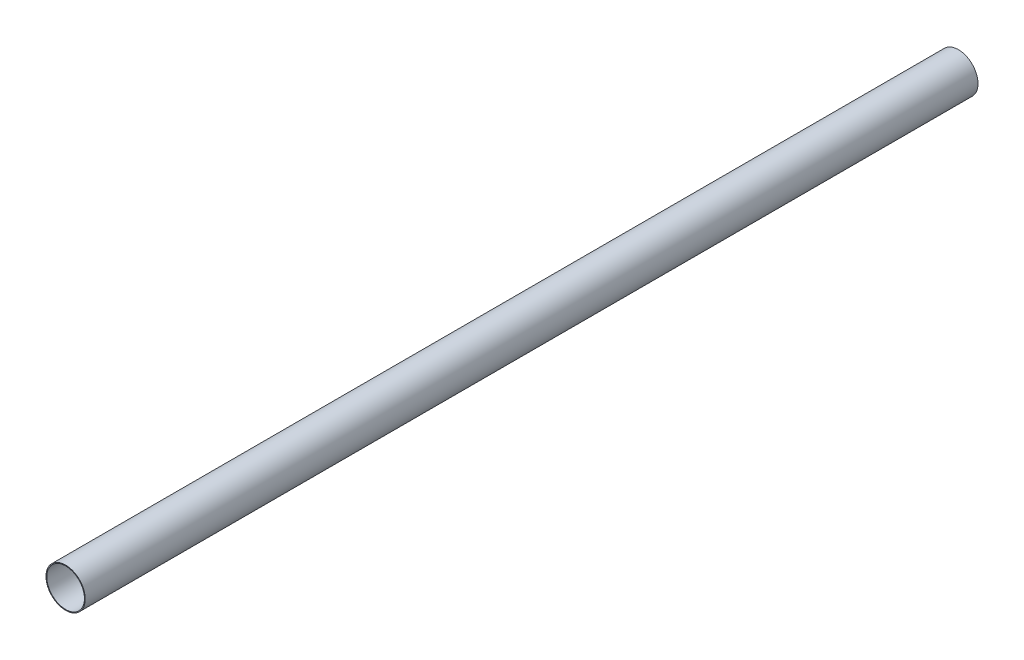
ISO-10303-21;
HEADER;
FILE_DESCRIPTION(('STEP AP214'),'2;1');
FILE_NAME('part.step','',(''),(''),'','','');
FILE_SCHEMA(('AUTOMOTIVE_DESIGN { 1 0 10303 214 1 1 1 1 }'));
ENDSEC;
DATA;
#1=APPLICATION_CONTEXT('core data for automotive mechanical design processes');
#2=APPLICATION_PROTOCOL_DEFINITION('international standard','automotive_design',2000,#1);
#3=PRODUCT_CONTEXT('',#1,'mechanical');
#4=PRODUCT('Part','Part','',(#3));
#5=PRODUCT_RELATED_PRODUCT_CATEGORY('part','',(#4));
#6=PRODUCT_DEFINITION_FORMATION('','',#4);
#7=PRODUCT_DEFINITION_CONTEXT('part definition',#1,'design');
#8=PRODUCT_DEFINITION('design','',#6,#7);
#9=PRODUCT_DEFINITION_SHAPE('','',#8);
#10=(LENGTH_UNIT() NAMED_UNIT(*) SI_UNIT(.MILLI.,.METRE.));
#11=(NAMED_UNIT(*) PLANE_ANGLE_UNIT() SI_UNIT($,.RADIAN.));
#12=(NAMED_UNIT(*) SI_UNIT($,.STERADIAN.) SOLID_ANGLE_UNIT());
#13=UNCERTAINTY_MEASURE_WITH_UNIT(LENGTH_MEASURE(1.E-05),#10,'distance_accuracy_value','');
#14=(GEOMETRIC_REPRESENTATION_CONTEXT(3) GLOBAL_UNCERTAINTY_ASSIGNED_CONTEXT((#13)) GLOBAL_UNIT_ASSIGNED_CONTEXT((#10,
#11,#12)) REPRESENTATION_CONTEXT('',''));
#15=CARTESIAN_POINT('',(0.,0.,0.));
#16=DIRECTION('',(0.,0.,1.));
#17=DIRECTION('',(1.,0.,0.));
#18=AXIS2_PLACEMENT_3D('',#15,#16,#17);
#19=CARTESIAN_POINT('',(0.,0.,2500.));
#20=DIRECTION('',(0.,0.,1.));
#21=DIRECTION('',(1.,0.,0.));
#22=AXIS2_PLACEMENT_3D('',#19,#20,#21);
#23=PLANE('',#22);
#24=CARTESIAN_POINT('',(0.,0.,2500.));
#25=DIRECTION('',(0.,0.,1.));
#26=DIRECTION('',(1.,0.,0.));
#27=AXIS2_PLACEMENT_3D('',#24,#25,#26);
#28=CIRCLE('',#27,55.);
#29=CARTESIAN_POINT('',(55.,0.,2500.));
#30=VERTEX_POINT('',#29);
#31=EDGE_CURVE('E10',#30,#30,#28,.T.);
#32=ORIENTED_EDGE('',*,*,#31,.T.);
#33=EDGE_LOOP('',(#32));
#34=FACE_BOUND('',#33,.T.);
#35=CARTESIAN_POINT('',(0.,0.,2500.));
#36=DIRECTION('',(0.,0.,1.));
#37=DIRECTION('',(1.,0.,0.));
#38=AXIS2_PLACEMENT_3D('',#35,#36,#37);
#39=CIRCLE('',#38,52.8);
#40=CARTESIAN_POINT('',(52.8,0.,2500.));
#41=VERTEX_POINT('',#40);
#42=EDGE_CURVE('E42',#41,#41,#39,.T.);
#43=ORIENTED_EDGE('',*,*,#42,.F.);
#44=EDGE_LOOP('',(#43));
#45=FACE_BOUND('',#44,.T.);
#46=ADVANCED_FACE('F31',(#34,#45),#23,.T.);
#47=CARTESIAN_POINT('',(0.,0.,0.));
#48=DIRECTION('',(0.,0.,1.));
#49=DIRECTION('',(1.,0.,0.));
#50=AXIS2_PLACEMENT_3D('',#47,#48,#49);
#51=PLANE('',#50);
#52=CARTESIAN_POINT('',(0.,0.,0.));
#53=DIRECTION('',(0.,0.,1.));
#54=DIRECTION('',(1.,0.,0.));
#55=AXIS2_PLACEMENT_3D('',#52,#53,#54);
#56=CIRCLE('',#55,55.);
#57=CARTESIAN_POINT('',(55.,0.,0.));
#58=VERTEX_POINT('',#57);
#59=EDGE_CURVE('E35',#58,#58,#56,.T.);
#60=ORIENTED_EDGE('',*,*,#59,.F.);
#61=EDGE_LOOP('',(#60));
#62=FACE_BOUND('',#61,.T.);
#63=CARTESIAN_POINT('',(0.,0.,0.));
#64=DIRECTION('',(0.,0.,1.));
#65=DIRECTION('',(1.,0.,0.));
#66=AXIS2_PLACEMENT_3D('',#63,#64,#65);
#67=CIRCLE('',#66,52.8);
#68=CARTESIAN_POINT('',(52.8,0.,0.));
#69=VERTEX_POINT('',#68);
#70=EDGE_CURVE('E44',#69,#69,#67,.T.);
#71=ORIENTED_EDGE('',*,*,#70,.T.);
#72=EDGE_LOOP('',(#71));
#73=FACE_BOUND('',#72,.T.);
#74=ADVANCED_FACE('F54',(#62,#73),#51,.F.);
#75=CARTESIAN_POINT('',(0.,0.,2500.));
#76=DIRECTION('',(0.,0.,-1.));
#77=DIRECTION('',(-1.,0.,0.));
#78=AXIS2_PLACEMENT_3D('',#75,#76,#77);
#79=CYLINDRICAL_SURFACE('',#78,55.);
#80=ORIENTED_EDGE('',*,*,#31,.F.);
#81=EDGE_LOOP('',(#80));
#82=FACE_BOUND('',#81,.T.);
#83=ORIENTED_EDGE('',*,*,#59,.T.);
#84=EDGE_LOOP('',(#83));
#85=FACE_BOUND('',#84,.T.);
#86=ADVANCED_FACE('F33',(#82,#85),#79,.T.);
#87=CARTESIAN_POINT('',(0.,0.,2500.));
#88=DIRECTION('',(0.,0.,-1.));
#89=DIRECTION('',(-1.,0.,0.));
#90=AXIS2_PLACEMENT_3D('',#87,#88,#89);
#91=CYLINDRICAL_SURFACE('',#90,52.8);
#92=ORIENTED_EDGE('',*,*,#42,.T.);
#93=EDGE_LOOP('',(#92));
#94=FACE_BOUND('',#93,.T.);
#95=ORIENTED_EDGE('',*,*,#70,.F.);
#96=EDGE_LOOP('',(#95));
#97=FACE_BOUND('',#96,.T.);
#98=ADVANCED_FACE('F50',(#94,#97),#91,.F.);
#99=CLOSED_SHELL('',(#46,#74,#86,#98));
#100=MANIFOLD_SOLID_BREP('B2',#99);
#101=ADVANCED_BREP_SHAPE_REPRESENTATION('',(#18,#100),#14);
#102=SHAPE_DEFINITION_REPRESENTATION(#9,#101);
ENDSEC;
END-ISO-10303-21;
